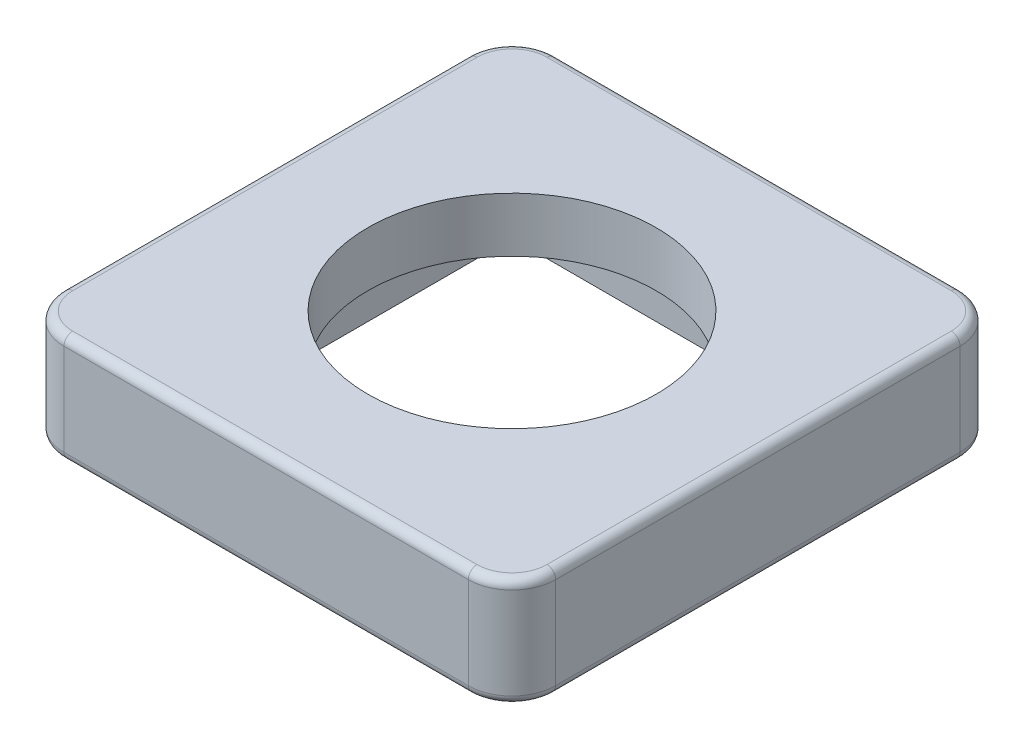
ISO-10303-21;
HEADER;
FILE_DESCRIPTION(('STEP AP214'),'2;1');
FILE_NAME('part.step','',(''),(''),'','','');
FILE_SCHEMA(('AUTOMOTIVE_DESIGN { 1 0 10303 214 1 1 1 1 }'));
ENDSEC;
DATA;
#1=APPLICATION_CONTEXT('core data for automotive mechanical design processes');
#2=APPLICATION_PROTOCOL_DEFINITION('international standard','automotive_design',2000,#1);
#3=PRODUCT_CONTEXT('',#1,'mechanical');
#4=PRODUCT('Part','Part','',(#3));
#5=PRODUCT_RELATED_PRODUCT_CATEGORY('part','',(#4));
#6=PRODUCT_DEFINITION_FORMATION('','',#4);
#7=PRODUCT_DEFINITION_CONTEXT('part definition',#1,'design');
#8=PRODUCT_DEFINITION('design','',#6,#7);
#9=PRODUCT_DEFINITION_SHAPE('','',#8);
#10=(LENGTH_UNIT() NAMED_UNIT(*) SI_UNIT(.MILLI.,.METRE.));
#11=(NAMED_UNIT(*) PLANE_ANGLE_UNIT() SI_UNIT($,.RADIAN.));
#12=(NAMED_UNIT(*) SI_UNIT($,.STERADIAN.) SOLID_ANGLE_UNIT());
#13=UNCERTAINTY_MEASURE_WITH_UNIT(LENGTH_MEASURE(1.E-05),#10,'distance_accuracy_value','');
#14=(GEOMETRIC_REPRESENTATION_CONTEXT(3) GLOBAL_UNCERTAINTY_ASSIGNED_CONTEXT((#13)) GLOBAL_UNIT_ASSIGNED_CONTEXT((#10,
#11,#12)) REPRESENTATION_CONTEXT('',''));
#15=CARTESIAN_POINT('',(0.,0.,0.));
#16=DIRECTION('',(0.,0.,1.));
#17=DIRECTION('',(1.,0.,0.));
#18=AXIS2_PLACEMENT_3D('',#15,#16,#17);
#19=CARTESIAN_POINT('',(28.575,12.7,28.575));
#20=DIRECTION('',(-1.,0.,0.));
#21=DIRECTION('',(0.,0.,1.));
#22=AXIS2_PLACEMENT_3D('',#19,#20,#21);
#23=PLANE('',#22);
#24=DIRECTION('',(0.,-1.,0.));
#25=VECTOR('',#24,1.);
#26=CARTESIAN_POINT('',(28.575,12.7,23.495));
#27=LINE('',#26,#25);
#28=CARTESIAN_POINT('',(28.575,11.684,23.495));
#29=VERTEX_POINT('',#28);
#30=CARTESIAN_POINT('',(28.575,1.016,23.495));
#31=VERTEX_POINT('',#30);
#32=EDGE_CURVE('E234',#29,#31,#27,.T.);
#33=ORIENTED_EDGE('',*,*,#32,.T.);
#34=DIRECTION('',(0.,0.,-1.));
#35=VECTOR('',#34,1.);
#36=CARTESIAN_POINT('',(28.575,1.016,-23.495));
#37=LINE('',#36,#35);
#38=CARTESIAN_POINT('',(28.575,1.016,-23.495));
#39=VERTEX_POINT('',#38);
#40=EDGE_CURVE('E276',#31,#39,#37,.T.);
#41=ORIENTED_EDGE('',*,*,#40,.T.);
#42=DIRECTION('',(0.,-1.,0.));
#43=VECTOR('',#42,1.);
#44=CARTESIAN_POINT('',(28.575,12.7,-23.495));
#45=LINE('',#44,#43);
#46=CARTESIAN_POINT('',(28.575,11.684,-23.495));
#47=VERTEX_POINT('',#46);
#48=EDGE_CURVE('E231',#39,#47,#45,.F.);
#49=ORIENTED_EDGE('',*,*,#48,.T.);
#50=DIRECTION('',(0.,0.,-1.));
#51=VECTOR('',#50,1.);
#52=CARTESIAN_POINT('',(28.575,11.684,28.575));
#53=LINE('',#52,#51);
#54=EDGE_CURVE('E274',#47,#29,#53,.F.);
#55=ORIENTED_EDGE('',*,*,#54,.T.);
#56=EDGE_LOOP('',(#33,#41,#49,#55));
#57=FACE_BOUND('',#56,.T.);
#58=ADVANCED_FACE('F33',(#57),#23,.F.);
#59=CARTESIAN_POINT('',(-28.575,12.7,-28.575));
#60=DIRECTION('',(0.,0.,1.));
#61=DIRECTION('',(1.,0.,0.));
#62=AXIS2_PLACEMENT_3D('',#59,#60,#61);
#63=PLANE('',#62);
#64=DIRECTION('',(0.,-1.,0.));
#65=VECTOR('',#64,1.);
#66=CARTESIAN_POINT('',(23.495,12.7,-28.575));
#67=LINE('',#66,#65);
#68=CARTESIAN_POINT('',(23.495,11.684,-28.575));
#69=VERTEX_POINT('',#68);
#70=CARTESIAN_POINT('',(23.495,1.016,-28.575));
#71=VERTEX_POINT('',#70);
#72=EDGE_CURVE('E240',#69,#71,#67,.T.);
#73=ORIENTED_EDGE('',*,*,#72,.T.);
#74=DIRECTION('',(-1.,0.,0.));
#75=VECTOR('',#74,1.);
#76=CARTESIAN_POINT('',(-23.495,1.016,-28.575));
#77=LINE('',#76,#75);
#78=CARTESIAN_POINT('',(-23.495,1.016,-28.575));
#79=VERTEX_POINT('',#78);
#80=EDGE_CURVE('E268',#71,#79,#77,.T.);
#81=ORIENTED_EDGE('',*,*,#80,.T.);
#82=DIRECTION('',(0.,-1.,0.));
#83=VECTOR('',#82,1.);
#84=CARTESIAN_POINT('',(-23.495,12.7,-28.575));
#85=LINE('',#84,#83);
#86=CARTESIAN_POINT('',(-23.495,11.684,-28.575));
#87=VERTEX_POINT('',#86);
#88=EDGE_CURVE('E237',#79,#87,#85,.F.);
#89=ORIENTED_EDGE('',*,*,#88,.T.);
#90=DIRECTION('',(-1.,0.,0.));
#91=VECTOR('',#90,1.);
#92=CARTESIAN_POINT('',(-28.575,11.684,-28.575));
#93=LINE('',#92,#91);
#94=EDGE_CURVE('E266',#87,#69,#93,.F.);
#95=ORIENTED_EDGE('',*,*,#94,.T.);
#96=EDGE_LOOP('',(#73,#81,#89,#95));
#97=FACE_BOUND('',#96,.T.);
#98=ADVANCED_FACE('F407',(#97),#63,.F.);
#99=CARTESIAN_POINT('',(-28.575,12.7,28.575));
#100=DIRECTION('',(1.,0.,0.));
#101=DIRECTION('',(0.,0.,-1.));
#102=AXIS2_PLACEMENT_3D('',#99,#100,#101);
#103=PLANE('',#102);
#104=DIRECTION('',(0.,-1.,0.));
#105=VECTOR('',#104,1.);
#106=CARTESIAN_POINT('',(-28.575,12.7,-23.495));
#107=LINE('',#106,#105);
#108=CARTESIAN_POINT('',(-28.575,11.684,-23.495));
#109=VERTEX_POINT('',#108);
#110=CARTESIAN_POINT('',(-28.575,1.016,-23.495));
#111=VERTEX_POINT('',#110);
#112=EDGE_CURVE('E225',#109,#111,#107,.T.);
#113=ORIENTED_EDGE('',*,*,#112,.T.);
#114=DIRECTION('',(0.,0.,1.));
#115=VECTOR('',#114,1.);
#116=CARTESIAN_POINT('',(-28.575,1.016,23.495));
#117=LINE('',#116,#115);
#118=CARTESIAN_POINT('',(-28.575,1.016,23.495));
#119=VERTEX_POINT('',#118);
#120=EDGE_CURVE('E11',#111,#119,#117,.T.);
#121=ORIENTED_EDGE('',*,*,#120,.T.);
#122=DIRECTION('',(0.,-1.,0.));
#123=VECTOR('',#122,1.);
#124=CARTESIAN_POINT('',(-28.575,12.7,23.495));
#125=LINE('',#124,#123);
#126=CARTESIAN_POINT('',(-28.575,11.684,23.495));
#127=VERTEX_POINT('',#126);
#128=EDGE_CURVE('E228',#119,#127,#125,.F.);
#129=ORIENTED_EDGE('',*,*,#128,.T.);
#130=DIRECTION('',(0.,0.,1.));
#131=VECTOR('',#130,1.);
#132=CARTESIAN_POINT('',(-28.575,11.684,28.575));
#133=LINE('',#132,#131);
#134=EDGE_CURVE('E42',#127,#109,#133,.F.);
#135=ORIENTED_EDGE('',*,*,#134,.T.);
#136=EDGE_LOOP('',(#113,#121,#129,#135));
#137=FACE_BOUND('',#136,.T.);
#138=ADVANCED_FACE('F421',(#137),#103,.F.);
#139=CARTESIAN_POINT('',(-28.575,12.7,28.575));
#140=DIRECTION('',(0.,0.,-1.));
#141=DIRECTION('',(-1.,0.,0.));
#142=AXIS2_PLACEMENT_3D('',#139,#140,#141);
#143=PLANE('',#142);
#144=DIRECTION('',(0.,-1.,0.));
#145=VECTOR('',#144,1.);
#146=CARTESIAN_POINT('',(-23.495,12.7,28.575));
#147=LINE('',#146,#145);
#148=CARTESIAN_POINT('',(-23.495,11.684,28.575));
#149=VERTEX_POINT('',#148);
#150=CARTESIAN_POINT('',(-23.495,1.016,28.575));
#151=VERTEX_POINT('',#150);
#152=EDGE_CURVE('E221',#149,#151,#147,.T.);
#153=ORIENTED_EDGE('',*,*,#152,.T.);
#154=DIRECTION('',(1.,0.,0.));
#155=VECTOR('',#154,1.);
#156=CARTESIAN_POINT('',(23.495,1.016,28.575));
#157=LINE('',#156,#155);
#158=CARTESIAN_POINT('',(23.495,1.016,28.575));
#159=VERTEX_POINT('',#158);
#160=EDGE_CURVE('E284',#151,#159,#157,.T.);
#161=ORIENTED_EDGE('',*,*,#160,.T.);
#162=DIRECTION('',(0.,-1.,0.));
#163=VECTOR('',#162,1.);
#164=CARTESIAN_POINT('',(23.495,12.7,28.575));
#165=LINE('',#164,#163);
#166=CARTESIAN_POINT('',(23.495,11.684,28.575));
#167=VERTEX_POINT('',#166);
#168=EDGE_CURVE('E218',#159,#167,#165,.F.);
#169=ORIENTED_EDGE('',*,*,#168,.T.);
#170=DIRECTION('',(1.,0.,0.));
#171=VECTOR('',#170,1.);
#172=CARTESIAN_POINT('',(-28.575,11.684,28.575));
#173=LINE('',#172,#171);
#174=EDGE_CURVE('E282',#167,#149,#173,.F.);
#175=ORIENTED_EDGE('',*,*,#174,.T.);
#176=EDGE_LOOP('',(#153,#161,#169,#175));
#177=FACE_BOUND('',#176,.T.);
#178=ADVANCED_FACE('F363',(#177),#143,.F.);
#179=CARTESIAN_POINT('',(0.,12.7,0.));
#180=DIRECTION('',(0.,-1.,0.));
#181=DIRECTION('',(0.,0.,-1.));
#182=AXIS2_PLACEMENT_3D('',#179,#180,#181);
#183=PLANE('',#182);
#184=CARTESIAN_POINT('',(0.,12.7,0.));
#185=DIRECTION('',(0.,1.,0.));
#186=DIRECTION('',(0.,0.,1.));
#187=AXIS2_PLACEMENT_3D('',#184,#185,#186);
#188=CIRCLE('',#187,16.764);
#189=CARTESIAN_POINT('',(0.,12.7,16.764));
#190=VERTEX_POINT('',#189);
#191=EDGE_CURVE('E214',#190,#190,#188,.T.);
#192=ORIENTED_EDGE('',*,*,#191,.F.);
#193=EDGE_LOOP('',(#192));
#194=FACE_BOUND('',#193,.T.);
#195=DIRECTION('',(-1.,0.,0.));
#196=VECTOR('',#195,1.);
#197=CARTESIAN_POINT('',(0.,12.7,-27.559));
#198=LINE('',#197,#196);
#199=CARTESIAN_POINT('',(23.495,12.7,-27.559));
#200=VERTEX_POINT('',#199);
#201=CARTESIAN_POINT('',(-23.495,12.7,-27.559));
#202=VERTEX_POINT('',#201);
#203=EDGE_CURVE('E58',#200,#202,#198,.T.);
#204=ORIENTED_EDGE('',*,*,#203,.T.);
#205=CARTESIAN_POINT('',(-23.495,12.7,-23.495));
#206=DIRECTION('',(0.,-1.,0.));
#207=DIRECTION('',(0.,0.,-1.));
#208=AXIS2_PLACEMENT_3D('',#205,#206,#207);
#209=CIRCLE('',#208,4.064);
#210=CARTESIAN_POINT('',(-27.559,12.7,-23.495));
#211=VERTEX_POINT('',#210);
#212=EDGE_CURVE('E303',#202,#211,#209,.F.);
#213=ORIENTED_EDGE('',*,*,#212,.T.);
#214=DIRECTION('',(0.,0.,1.));
#215=VECTOR('',#214,1.);
#216=CARTESIAN_POINT('',(-27.559,12.7,0.));
#217=LINE('',#216,#215);
#218=CARTESIAN_POINT('',(-27.559,12.7,23.495));
#219=VERTEX_POINT('',#218);
#220=EDGE_CURVE('E290',#211,#219,#217,.T.);
#221=ORIENTED_EDGE('',*,*,#220,.T.);
#222=CARTESIAN_POINT('',(-23.495,12.7,23.495));
#223=DIRECTION('',(0.,-1.,0.));
#224=DIRECTION('',(0.,0.,-1.));
#225=AXIS2_PLACEMENT_3D('',#222,#223,#224);
#226=CIRCLE('',#225,4.064);
#227=CARTESIAN_POINT('',(-23.495,12.7,27.559));
#228=VERTEX_POINT('',#227);
#229=EDGE_CURVE('E292',#219,#228,#226,.F.);
#230=ORIENTED_EDGE('',*,*,#229,.T.);
#231=DIRECTION('',(1.,0.,0.));
#232=VECTOR('',#231,1.);
#233=CARTESIAN_POINT('',(0.,12.7,27.559));
#234=LINE('',#233,#232);
#235=CARTESIAN_POINT('',(23.495,12.7,27.559));
#236=VERTEX_POINT('',#235);
#237=EDGE_CURVE('E294',#228,#236,#234,.T.);
#238=ORIENTED_EDGE('',*,*,#237,.T.);
#239=CARTESIAN_POINT('',(23.495,12.7,23.495));
#240=DIRECTION('',(0.,-1.,0.));
#241=DIRECTION('',(0.,0.,-1.));
#242=AXIS2_PLACEMENT_3D('',#239,#240,#241);
#243=CIRCLE('',#242,4.064);
#244=CARTESIAN_POINT('',(27.559,12.7,23.495));
#245=VERTEX_POINT('',#244);
#246=EDGE_CURVE('E296',#236,#245,#243,.F.);
#247=ORIENTED_EDGE('',*,*,#246,.T.);
#248=DIRECTION('',(0.,0.,-1.));
#249=VECTOR('',#248,1.);
#250=CARTESIAN_POINT('',(27.559,12.7,0.));
#251=LINE('',#250,#249);
#252=CARTESIAN_POINT('',(27.559,12.7,-23.495));
#253=VERTEX_POINT('',#252);
#254=EDGE_CURVE('E298',#245,#253,#251,.T.);
#255=ORIENTED_EDGE('',*,*,#254,.T.);
#256=CARTESIAN_POINT('',(23.495,12.7,-23.495));
#257=DIRECTION('',(0.,-1.,0.));
#258=DIRECTION('',(0.,0.,-1.));
#259=AXIS2_PLACEMENT_3D('',#256,#257,#258);
#260=CIRCLE('',#259,4.064);
#261=EDGE_CURVE('E300',#253,#200,#260,.F.);
#262=ORIENTED_EDGE('',*,*,#261,.T.);
#263=EDGE_LOOP('',(#204,#213,#221,#230,#238,#247,#255,#262));
#264=FACE_BOUND('',#263,.T.);
#265=ADVANCED_FACE('F445',(#194,#264),#183,.F.);
#266=CARTESIAN_POINT('',(0.,0.,0.));
#267=DIRECTION('',(0.,-1.,0.));
#268=DIRECTION('',(0.,0.,-1.));
#269=AXIS2_PLACEMENT_3D('',#266,#267,#268);
#270=PLANE('',#269);
#271=DIRECTION('',(0.,0.,1.));
#272=VECTOR('',#271,1.);
#273=CARTESIAN_POINT('',(20.,0.,-20.));
#274=LINE('',#273,#272);
#275=CARTESIAN_POINT('',(20.,0.,-20.));
#276=VERTEX_POINT('',#275);
#277=CARTESIAN_POINT('',(20.,0.,20.));
#278=VERTEX_POINT('',#277);
#279=EDGE_CURVE('E50',#276,#278,#274,.T.);
#280=ORIENTED_EDGE('',*,*,#279,.F.);
#281=DIRECTION('',(1.,0.,0.));
#282=VECTOR('',#281,1.);
#283=CARTESIAN_POINT('',(-20.,0.,-20.));
#284=LINE('',#283,#282);
#285=CARTESIAN_POINT('',(-20.,0.,-20.));
#286=VERTEX_POINT('',#285);
#287=EDGE_CURVE('E193',#286,#276,#284,.T.);
#288=ORIENTED_EDGE('',*,*,#287,.F.);
#289=DIRECTION('',(0.,0.,-1.));
#290=VECTOR('',#289,1.);
#291=CARTESIAN_POINT('',(-20.,0.,-20.));
#292=LINE('',#291,#290);
#293=CARTESIAN_POINT('',(-20.,0.,20.));
#294=VERTEX_POINT('',#293);
#295=EDGE_CURVE('E196',#294,#286,#292,.T.);
#296=ORIENTED_EDGE('',*,*,#295,.F.);
#297=DIRECTION('',(-1.,0.,0.));
#298=VECTOR('',#297,1.);
#299=CARTESIAN_POINT('',(-20.,0.,20.));
#300=LINE('',#299,#298);
#301=EDGE_CURVE('E202',#278,#294,#300,.T.);
#302=ORIENTED_EDGE('',*,*,#301,.F.);
#303=EDGE_LOOP('',(#280,#288,#296,#302));
#304=FACE_BOUND('',#303,.T.);
#305=DIRECTION('',(0.,0.,1.));
#306=VECTOR('',#305,1.);
#307=CARTESIAN_POINT('',(-27.559,0.,-23.495));
#308=LINE('',#307,#306);
#309=CARTESIAN_POINT('',(-27.559,0.,23.495));
#310=VERTEX_POINT('',#309);
#311=CARTESIAN_POINT('',(-27.559,0.,-23.495));
#312=VERTEX_POINT('',#311);
#313=EDGE_CURVE('E243',#310,#312,#308,.F.);
#314=ORIENTED_EDGE('',*,*,#313,.T.);
#315=CARTESIAN_POINT('',(-23.495,0.,-23.495));
#316=DIRECTION('',(0.,-1.,0.));
#317=DIRECTION('',(0.,0.,-1.));
#318=AXIS2_PLACEMENT_3D('',#315,#316,#317);
#319=CIRCLE('',#318,4.064);
#320=CARTESIAN_POINT('',(-23.495,0.,-27.559));
#321=VERTEX_POINT('',#320);
#322=EDGE_CURVE('E257',#312,#321,#319,.T.);
#323=ORIENTED_EDGE('',*,*,#322,.T.);
#324=DIRECTION('',(-1.,0.,0.));
#325=VECTOR('',#324,1.);
#326=CARTESIAN_POINT('',(23.495,0.,-27.559));
#327=LINE('',#326,#325);
#328=CARTESIAN_POINT('',(23.495,0.,-27.559));
#329=VERTEX_POINT('',#328);
#330=EDGE_CURVE('E255',#321,#329,#327,.F.);
#331=ORIENTED_EDGE('',*,*,#330,.T.);
#332=CARTESIAN_POINT('',(23.495,0.,-23.495));
#333=DIRECTION('',(0.,-1.,0.));
#334=DIRECTION('',(0.,0.,-1.));
#335=AXIS2_PLACEMENT_3D('',#332,#333,#334);
#336=CIRCLE('',#335,4.064);
#337=CARTESIAN_POINT('',(27.559,0.,-23.495));
#338=VERTEX_POINT('',#337);
#339=EDGE_CURVE('E253',#329,#338,#336,.T.);
#340=ORIENTED_EDGE('',*,*,#339,.T.);
#341=DIRECTION('',(0.,0.,-1.));
#342=VECTOR('',#341,1.);
#343=CARTESIAN_POINT('',(27.559,0.,23.495));
#344=LINE('',#343,#342);
#345=CARTESIAN_POINT('',(27.559,0.,23.495));
#346=VERTEX_POINT('',#345);
#347=EDGE_CURVE('E251',#338,#346,#344,.F.);
#348=ORIENTED_EDGE('',*,*,#347,.T.);
#349=CARTESIAN_POINT('',(23.495,0.,23.495));
#350=DIRECTION('',(0.,-1.,0.));
#351=DIRECTION('',(0.,0.,-1.));
#352=AXIS2_PLACEMENT_3D('',#349,#350,#351);
#353=CIRCLE('',#352,4.064);
#354=CARTESIAN_POINT('',(23.495,0.,27.559));
#355=VERTEX_POINT('',#354);
#356=EDGE_CURVE('E249',#346,#355,#353,.T.);
#357=ORIENTED_EDGE('',*,*,#356,.T.);
#358=DIRECTION('',(1.,0.,0.));
#359=VECTOR('',#358,1.);
#360=CARTESIAN_POINT('',(-23.495,0.,27.559));
#361=LINE('',#360,#359);
#362=CARTESIAN_POINT('',(-23.495,0.,27.559));
#363=VERTEX_POINT('',#362);
#364=EDGE_CURVE('E247',#355,#363,#361,.F.);
#365=ORIENTED_EDGE('',*,*,#364,.T.);
#366=CARTESIAN_POINT('',(-23.495,0.,23.495));
#367=DIRECTION('',(0.,-1.,0.));
#368=DIRECTION('',(0.,0.,-1.));
#369=AXIS2_PLACEMENT_3D('',#366,#367,#368);
#370=CIRCLE('',#369,4.064);
#371=EDGE_CURVE('E245',#363,#310,#370,.T.);
#372=ORIENTED_EDGE('',*,*,#371,.T.);
#373=EDGE_LOOP('',(#314,#323,#331,#340,#348,#357,#365,#372));
#374=FACE_BOUND('',#373,.T.);
#375=ADVANCED_FACE('F378',(#304,#374),#270,.T.);
#376=CARTESIAN_POINT('',(-23.495,12.7,23.495));
#377=DIRECTION('',(0.,-1.,0.));
#378=DIRECTION('',(0.,0.,-1.));
#379=AXIS2_PLACEMENT_3D('',#376,#377,#378);
#380=CYLINDRICAL_SURFACE('',#379,5.08);
#381=ORIENTED_EDGE('',*,*,#128,.F.);
#382=CARTESIAN_POINT('',(-23.495,1.016,23.495));
#383=DIRECTION('',(0.,-1.,0.));
#384=DIRECTION('',(0.,0.,-1.));
#385=AXIS2_PLACEMENT_3D('',#382,#383,#384);
#386=CIRCLE('',#385,5.08);
#387=EDGE_CURVE('E288',#119,#151,#386,.F.);
#388=ORIENTED_EDGE('',*,*,#387,.T.);
#389=ORIENTED_EDGE('',*,*,#152,.F.);
#390=CARTESIAN_POINT('',(-23.495,11.684,23.495));
#391=DIRECTION('',(0.,-1.,0.));
#392=DIRECTION('',(0.,0.,-1.));
#393=AXIS2_PLACEMENT_3D('',#390,#391,#392);
#394=CIRCLE('',#393,5.08);
#395=EDGE_CURVE('E286',#149,#127,#394,.T.);
#396=ORIENTED_EDGE('',*,*,#395,.T.);
#397=EDGE_LOOP('',(#381,#388,#389,#396));
#398=FACE_BOUND('',#397,.T.);
#399=ADVANCED_FACE('F424',(#398),#380,.T.);
#400=CARTESIAN_POINT('',(23.495,12.7,23.495));
#401=DIRECTION('',(0.,-1.,0.));
#402=DIRECTION('',(0.,0.,-1.));
#403=AXIS2_PLACEMENT_3D('',#400,#401,#402);
#404=CYLINDRICAL_SURFACE('',#403,5.08);
#405=ORIENTED_EDGE('',*,*,#168,.F.);
#406=CARTESIAN_POINT('',(23.495,1.016,23.495));
#407=DIRECTION('',(0.,-1.,0.));
#408=DIRECTION('',(0.,0.,-1.));
#409=AXIS2_PLACEMENT_3D('',#406,#407,#408);
#410=CIRCLE('',#409,5.08);
#411=EDGE_CURVE('E280',#159,#31,#410,.F.);
#412=ORIENTED_EDGE('',*,*,#411,.T.);
#413=ORIENTED_EDGE('',*,*,#32,.F.);
#414=CARTESIAN_POINT('',(23.495,11.684,23.495));
#415=DIRECTION('',(0.,-1.,0.));
#416=DIRECTION('',(0.,0.,-1.));
#417=AXIS2_PLACEMENT_3D('',#414,#415,#416);
#418=CIRCLE('',#417,5.08);
#419=EDGE_CURVE('E278',#29,#167,#418,.T.);
#420=ORIENTED_EDGE('',*,*,#419,.T.);
#421=EDGE_LOOP('',(#405,#412,#413,#420));
#422=FACE_BOUND('',#421,.T.);
#423=ADVANCED_FACE('F360',(#422),#404,.T.);
#424=CARTESIAN_POINT('',(23.495,12.7,-23.495));
#425=DIRECTION('',(0.,-1.,0.));
#426=DIRECTION('',(0.,0.,-1.));
#427=AXIS2_PLACEMENT_3D('',#424,#425,#426);
#428=CYLINDRICAL_SURFACE('',#427,5.08);
#429=ORIENTED_EDGE('',*,*,#48,.F.);
#430=CARTESIAN_POINT('',(23.495,1.016,-23.495));
#431=DIRECTION('',(0.,-1.,0.));
#432=DIRECTION('',(0.,0.,-1.));
#433=AXIS2_PLACEMENT_3D('',#430,#431,#432);
#434=CIRCLE('',#433,5.08);
#435=EDGE_CURVE('E272',#39,#71,#434,.F.);
#436=ORIENTED_EDGE('',*,*,#435,.T.);
#437=ORIENTED_EDGE('',*,*,#72,.F.);
#438=CARTESIAN_POINT('',(23.495,11.684,-23.495));
#439=DIRECTION('',(0.,-1.,0.));
#440=DIRECTION('',(0.,0.,-1.));
#441=AXIS2_PLACEMENT_3D('',#438,#439,#440);
#442=CIRCLE('',#441,5.08);
#443=EDGE_CURVE('E270',#69,#47,#442,.T.);
#444=ORIENTED_EDGE('',*,*,#443,.T.);
#445=EDGE_LOOP('',(#429,#436,#437,#444));
#446=FACE_BOUND('',#445,.T.);
#447=ADVANCED_FACE('F390',(#446),#428,.T.);
#448=CARTESIAN_POINT('',(-23.495,12.7,-23.495));
#449=DIRECTION('',(0.,-1.,0.));
#450=DIRECTION('',(0.,0.,-1.));
#451=AXIS2_PLACEMENT_3D('',#448,#449,#450);
#452=CYLINDRICAL_SURFACE('',#451,5.08);
#453=ORIENTED_EDGE('',*,*,#88,.F.);
#454=CARTESIAN_POINT('',(-23.495,1.016,-23.495));
#455=DIRECTION('',(0.,-1.,0.));
#456=DIRECTION('',(0.,0.,-1.));
#457=AXIS2_PLACEMENT_3D('',#454,#455,#456);
#458=CIRCLE('',#457,5.08);
#459=EDGE_CURVE('E263',#79,#111,#458,.F.);
#460=ORIENTED_EDGE('',*,*,#459,.T.);
#461=ORIENTED_EDGE('',*,*,#112,.F.);
#462=CARTESIAN_POINT('',(-23.495,11.684,-23.495));
#463=DIRECTION('',(0.,-1.,0.));
#464=DIRECTION('',(0.,0.,-1.));
#465=AXIS2_PLACEMENT_3D('',#462,#463,#464);
#466=CIRCLE('',#465,5.08);
#467=EDGE_CURVE('E260',#109,#87,#466,.T.);
#468=ORIENTED_EDGE('',*,*,#467,.T.);
#469=EDGE_LOOP('',(#453,#460,#461,#468));
#470=FACE_BOUND('',#469,.T.);
#471=ADVANCED_FACE('F410',(#470),#452,.T.);
#472=CARTESIAN_POINT('',(23.495,1.016,23.495));
#473=DIRECTION('',(0.,-1.,0.));
#474=DIRECTION('',(0.,0.,-1.));
#475=AXIS2_PLACEMENT_3D('',#472,#473,#474);
#476=TOROIDAL_SURFACE('',#475,4.064,1.016);
#477=CARTESIAN_POINT('',(27.559,1.016,23.495));
#478=DIRECTION('',(0.,0.,-1.));
#479=DIRECTION('',(-1.,0.,0.));
#480=AXIS2_PLACEMENT_3D('',#477,#478,#479);
#481=CIRCLE('',#480,1.016);
#482=EDGE_CURVE('E322',#31,#346,#481,.T.);
#483=ORIENTED_EDGE('',*,*,#482,.F.);
#484=ORIENTED_EDGE('',*,*,#411,.F.);
#485=CARTESIAN_POINT('',(23.495,1.016,27.559));
#486=DIRECTION('',(-1.,0.,0.));
#487=DIRECTION('',(0.,0.,1.));
#488=AXIS2_PLACEMENT_3D('',#485,#486,#487);
#489=CIRCLE('',#488,1.016);
#490=EDGE_CURVE('E222',#355,#159,#489,.T.);
#491=ORIENTED_EDGE('',*,*,#490,.F.);
#492=ORIENTED_EDGE('',*,*,#356,.F.);
#493=EDGE_LOOP('',(#483,#484,#491,#492));
#494=FACE_BOUND('',#493,.T.);
#495=ADVANCED_FACE('F384',(#494),#476,.T.);
#496=CARTESIAN_POINT('',(-28.575,1.016,27.559));
#497=DIRECTION('',(-1.,0.,0.));
#498=DIRECTION('',(0.,0.,1.));
#499=AXIS2_PLACEMENT_3D('',#496,#497,#498);
#500=CYLINDRICAL_SURFACE('',#499,1.016);
#501=ORIENTED_EDGE('',*,*,#490,.T.);
#502=ORIENTED_EDGE('',*,*,#160,.F.);
#503=CARTESIAN_POINT('',(-23.495,1.016,27.559));
#504=DIRECTION('',(-1.,0.,0.));
#505=DIRECTION('',(0.,0.,1.));
#506=AXIS2_PLACEMENT_3D('',#503,#504,#505);
#507=CIRCLE('',#506,1.016);
#508=EDGE_CURVE('E319',#363,#151,#507,.T.);
#509=ORIENTED_EDGE('',*,*,#508,.F.);
#510=ORIENTED_EDGE('',*,*,#364,.F.);
#511=EDGE_LOOP('',(#501,#502,#509,#510));
#512=FACE_BOUND('',#511,.T.);
#513=ADVANCED_FACE('F368',(#512),#500,.T.);
#514=CARTESIAN_POINT('',(27.559,1.016,28.575));
#515=DIRECTION('',(0.,0.,1.));
#516=DIRECTION('',(1.,0.,0.));
#517=AXIS2_PLACEMENT_3D('',#514,#515,#516);
#518=CYLINDRICAL_SURFACE('',#517,1.016);
#519=ORIENTED_EDGE('',*,*,#482,.T.);
#520=ORIENTED_EDGE('',*,*,#347,.F.);
#521=CARTESIAN_POINT('',(27.559,1.016,-23.495));
#522=DIRECTION('',(0.,0.,-1.));
#523=DIRECTION('',(-1.,0.,0.));
#524=AXIS2_PLACEMENT_3D('',#521,#522,#523);
#525=CIRCLE('',#524,1.016);
#526=EDGE_CURVE('E316',#39,#338,#525,.T.);
#527=ORIENTED_EDGE('',*,*,#526,.F.);
#528=ORIENTED_EDGE('',*,*,#40,.F.);
#529=EDGE_LOOP('',(#519,#520,#527,#528));
#530=FACE_BOUND('',#529,.T.);
#531=ADVANCED_FACE('F395',(#530),#518,.T.);
#532=CARTESIAN_POINT('',(-23.495,1.016,23.495));
#533=DIRECTION('',(0.,-1.,0.));
#534=DIRECTION('',(0.,0.,-1.));
#535=AXIS2_PLACEMENT_3D('',#532,#533,#534);
#536=TOROIDAL_SURFACE('',#535,4.064,1.016);
#537=ORIENTED_EDGE('',*,*,#508,.T.);
#538=ORIENTED_EDGE('',*,*,#387,.F.);
#539=CARTESIAN_POINT('',(-27.559,1.016,23.495));
#540=DIRECTION('',(0.,0.,-1.));
#541=DIRECTION('',(-1.,0.,0.));
#542=AXIS2_PLACEMENT_3D('',#539,#540,#541);
#543=CIRCLE('',#542,1.016);
#544=EDGE_CURVE('E313',#310,#119,#543,.T.);
#545=ORIENTED_EDGE('',*,*,#544,.F.);
#546=ORIENTED_EDGE('',*,*,#371,.F.);
#547=EDGE_LOOP('',(#537,#538,#545,#546));
#548=FACE_BOUND('',#547,.T.);
#549=ADVANCED_FACE('F374',(#548),#536,.T.);
#550=CARTESIAN_POINT('',(23.495,1.016,-23.495));
#551=DIRECTION('',(0.,-1.,0.));
#552=DIRECTION('',(0.,0.,-1.));
#553=AXIS2_PLACEMENT_3D('',#550,#551,#552);
#554=TOROIDAL_SURFACE('',#553,4.064,1.016);
#555=ORIENTED_EDGE('',*,*,#526,.T.);
#556=ORIENTED_EDGE('',*,*,#339,.F.);
#557=CARTESIAN_POINT('',(23.495,1.016,-27.559));
#558=DIRECTION('',(-1.,0.,0.));
#559=DIRECTION('',(0.,0.,1.));
#560=AXIS2_PLACEMENT_3D('',#557,#558,#559);
#561=CIRCLE('',#560,1.016);
#562=EDGE_CURVE('E310',#71,#329,#561,.T.);
#563=ORIENTED_EDGE('',*,*,#562,.F.);
#564=ORIENTED_EDGE('',*,*,#435,.F.);
#565=EDGE_LOOP('',(#555,#556,#563,#564));
#566=FACE_BOUND('',#565,.T.);
#567=ADVANCED_FACE('F399',(#566),#554,.T.);
#568=CARTESIAN_POINT('',(-27.559,1.016,28.575));
#569=DIRECTION('',(0.,0.,-1.));
#570=DIRECTION('',(-1.,0.,0.));
#571=AXIS2_PLACEMENT_3D('',#568,#569,#570);
#572=CYLINDRICAL_SURFACE('',#571,1.016);
#573=ORIENTED_EDGE('',*,*,#544,.T.);
#574=ORIENTED_EDGE('',*,*,#120,.F.);
#575=CARTESIAN_POINT('',(-27.559,1.016,-23.495));
#576=DIRECTION('',(0.,0.,-1.));
#577=DIRECTION('',(-1.,0.,0.));
#578=AXIS2_PLACEMENT_3D('',#575,#576,#577);
#579=CIRCLE('',#578,1.016);
#580=EDGE_CURVE('E308',#312,#111,#579,.T.);
#581=ORIENTED_EDGE('',*,*,#580,.F.);
#582=ORIENTED_EDGE('',*,*,#313,.F.);
#583=EDGE_LOOP('',(#573,#574,#581,#582));
#584=FACE_BOUND('',#583,.T.);
#585=ADVANCED_FACE('F418',(#584),#572,.T.);
#586=CARTESIAN_POINT('',(-28.575,1.016,-27.559));
#587=DIRECTION('',(1.,0.,0.));
#588=DIRECTION('',(0.,0.,-1.));
#589=AXIS2_PLACEMENT_3D('',#586,#587,#588);
#590=CYLINDRICAL_SURFACE('',#589,1.016);
#591=ORIENTED_EDGE('',*,*,#562,.T.);
#592=ORIENTED_EDGE('',*,*,#330,.F.);
#593=CARTESIAN_POINT('',(-23.495,1.016,-27.559));
#594=DIRECTION('',(-1.,0.,0.));
#595=DIRECTION('',(0.,0.,1.));
#596=AXIS2_PLACEMENT_3D('',#593,#594,#595);
#597=CIRCLE('',#596,1.016);
#598=EDGE_CURVE('E306',#79,#321,#597,.T.);
#599=ORIENTED_EDGE('',*,*,#598,.F.);
#600=ORIENTED_EDGE('',*,*,#80,.F.);
#601=EDGE_LOOP('',(#591,#592,#599,#600));
#602=FACE_BOUND('',#601,.T.);
#603=ADVANCED_FACE('F404',(#602),#590,.T.);
#604=CARTESIAN_POINT('',(-23.495,1.016,-23.495));
#605=DIRECTION('',(0.,-1.,0.));
#606=DIRECTION('',(0.,0.,-1.));
#607=AXIS2_PLACEMENT_3D('',#604,#605,#606);
#608=TOROIDAL_SURFACE('',#607,4.064,1.016);
#609=ORIENTED_EDGE('',*,*,#580,.T.);
#610=ORIENTED_EDGE('',*,*,#459,.F.);
#611=ORIENTED_EDGE('',*,*,#598,.T.);
#612=ORIENTED_EDGE('',*,*,#322,.F.);
#613=EDGE_LOOP('',(#609,#610,#611,#612));
#614=FACE_BOUND('',#613,.T.);
#615=ADVANCED_FACE('F414',(#614),#608,.T.);
#616=CARTESIAN_POINT('',(23.495,11.684,23.495));
#617=DIRECTION('',(0.,-1.,0.));
#618=DIRECTION('',(0.,0.,-1.));
#619=AXIS2_PLACEMENT_3D('',#616,#617,#618);
#620=TOROIDAL_SURFACE('',#619,4.064,1.016);
#621=CARTESIAN_POINT('',(23.495,11.684,27.559));
#622=DIRECTION('',(-1.,0.,0.));
#623=DIRECTION('',(0.,0.,1.));
#624=AXIS2_PLACEMENT_3D('',#621,#622,#623);
#625=CIRCLE('',#624,1.016);
#626=EDGE_CURVE('E341',#167,#236,#625,.T.);
#627=ORIENTED_EDGE('',*,*,#626,.F.);
#628=ORIENTED_EDGE('',*,*,#419,.F.);
#629=CARTESIAN_POINT('',(27.559,11.684,23.495));
#630=DIRECTION('',(0.,0.,-1.));
#631=DIRECTION('',(-1.,0.,0.));
#632=AXIS2_PLACEMENT_3D('',#629,#630,#631);
#633=CIRCLE('',#632,1.016);
#634=EDGE_CURVE('E37',#245,#29,#633,.T.);
#635=ORIENTED_EDGE('',*,*,#634,.F.);
#636=ORIENTED_EDGE('',*,*,#246,.F.);
#637=EDGE_LOOP('',(#627,#628,#635,#636));
#638=FACE_BOUND('',#637,.T.);
#639=ADVANCED_FACE('F35',(#638),#620,.T.);
#640=CARTESIAN_POINT('',(27.559,11.684,0.));
#641=DIRECTION('',(0.,0.,-1.));
#642=DIRECTION('',(-1.,0.,0.));
#643=AXIS2_PLACEMENT_3D('',#640,#641,#642);
#644=CYLINDRICAL_SURFACE('',#643,1.016);
#645=ORIENTED_EDGE('',*,*,#634,.T.);
#646=ORIENTED_EDGE('',*,*,#54,.F.);
#647=CARTESIAN_POINT('',(27.559,11.684,-23.495));
#648=DIRECTION('',(0.,0.,-1.));
#649=DIRECTION('',(-1.,0.,0.));
#650=AXIS2_PLACEMENT_3D('',#647,#648,#649);
#651=CIRCLE('',#650,1.016);
#652=EDGE_CURVE('E339',#253,#47,#651,.T.);
#653=ORIENTED_EDGE('',*,*,#652,.F.);
#654=ORIENTED_EDGE('',*,*,#254,.F.);
#655=EDGE_LOOP('',(#645,#646,#653,#654));
#656=FACE_BOUND('',#655,.T.);
#657=ADVANCED_FACE('F352',(#656),#644,.T.);
#658=CARTESIAN_POINT('',(0.,11.684,27.559));
#659=DIRECTION('',(1.,0.,0.));
#660=DIRECTION('',(0.,0.,-1.));
#661=AXIS2_PLACEMENT_3D('',#658,#659,#660);
#662=CYLINDRICAL_SURFACE('',#661,1.016);
#663=ORIENTED_EDGE('',*,*,#626,.T.);
#664=ORIENTED_EDGE('',*,*,#237,.F.);
#665=CARTESIAN_POINT('',(-23.495,11.684,27.559));
#666=DIRECTION('',(-1.,0.,0.));
#667=DIRECTION('',(0.,0.,1.));
#668=AXIS2_PLACEMENT_3D('',#665,#666,#667);
#669=CIRCLE('',#668,1.016);
#670=EDGE_CURVE('E336',#149,#228,#669,.T.);
#671=ORIENTED_EDGE('',*,*,#670,.F.);
#672=ORIENTED_EDGE('',*,*,#174,.F.);
#673=EDGE_LOOP('',(#663,#664,#671,#672));
#674=FACE_BOUND('',#673,.T.);
#675=ADVANCED_FACE('F446',(#674),#662,.T.);
#676=CARTESIAN_POINT('',(23.495,11.684,-23.495));
#677=DIRECTION('',(0.,-1.,0.));
#678=DIRECTION('',(0.,0.,-1.));
#679=AXIS2_PLACEMENT_3D('',#676,#677,#678);
#680=TOROIDAL_SURFACE('',#679,4.064,1.016);
#681=ORIENTED_EDGE('',*,*,#652,.T.);
#682=ORIENTED_EDGE('',*,*,#443,.F.);
#683=CARTESIAN_POINT('',(23.495,11.684,-27.559));
#684=DIRECTION('',(-1.,0.,0.));
#685=DIRECTION('',(0.,0.,1.));
#686=AXIS2_PLACEMENT_3D('',#683,#684,#685);
#687=CIRCLE('',#686,1.016);
#688=EDGE_CURVE('E333',#200,#69,#687,.T.);
#689=ORIENTED_EDGE('',*,*,#688,.F.);
#690=ORIENTED_EDGE('',*,*,#261,.F.);
#691=EDGE_LOOP('',(#681,#682,#689,#690));
#692=FACE_BOUND('',#691,.T.);
#693=ADVANCED_FACE('F443',(#692),#680,.T.);
#694=CARTESIAN_POINT('',(-23.495,11.684,23.495));
#695=DIRECTION('',(0.,-1.,0.));
#696=DIRECTION('',(0.,0.,-1.));
#697=AXIS2_PLACEMENT_3D('',#694,#695,#696);
#698=TOROIDAL_SURFACE('',#697,4.064,1.016);
#699=ORIENTED_EDGE('',*,*,#670,.T.);
#700=ORIENTED_EDGE('',*,*,#229,.F.);
#701=CARTESIAN_POINT('',(-27.559,11.684,23.495));
#702=DIRECTION('',(0.,0.,-1.));
#703=DIRECTION('',(-1.,0.,0.));
#704=AXIS2_PLACEMENT_3D('',#701,#702,#703);
#705=CIRCLE('',#704,1.016);
#706=EDGE_CURVE('E330',#127,#219,#705,.T.);
#707=ORIENTED_EDGE('',*,*,#706,.F.);
#708=ORIENTED_EDGE('',*,*,#395,.F.);
#709=EDGE_LOOP('',(#699,#700,#707,#708));
#710=FACE_BOUND('',#709,.T.);
#711=ADVANCED_FACE('F428',(#710),#698,.T.);
#712=CARTESIAN_POINT('',(0.,11.684,-27.559));
#713=DIRECTION('',(-1.,0.,0.));
#714=DIRECTION('',(0.,0.,1.));
#715=AXIS2_PLACEMENT_3D('',#712,#713,#714);
#716=CYLINDRICAL_SURFACE('',#715,1.016);
#717=ORIENTED_EDGE('',*,*,#688,.T.);
#718=ORIENTED_EDGE('',*,*,#94,.F.);
#719=CARTESIAN_POINT('',(-23.495,11.684,-27.559));
#720=DIRECTION('',(-1.,0.,0.));
#721=DIRECTION('',(0.,0.,1.));
#722=AXIS2_PLACEMENT_3D('',#719,#720,#721);
#723=CIRCLE('',#722,1.016);
#724=EDGE_CURVE('E328',#202,#87,#723,.T.);
#725=ORIENTED_EDGE('',*,*,#724,.F.);
#726=ORIENTED_EDGE('',*,*,#203,.F.);
#727=EDGE_LOOP('',(#717,#718,#725,#726));
#728=FACE_BOUND('',#727,.T.);
#729=ADVANCED_FACE('F440',(#728),#716,.T.);
#730=CARTESIAN_POINT('',(-27.559,11.684,0.));
#731=DIRECTION('',(0.,0.,1.));
#732=DIRECTION('',(1.,0.,0.));
#733=AXIS2_PLACEMENT_3D('',#730,#731,#732);
#734=CYLINDRICAL_SURFACE('',#733,1.016);
#735=ORIENTED_EDGE('',*,*,#706,.T.);
#736=ORIENTED_EDGE('',*,*,#220,.F.);
#737=CARTESIAN_POINT('',(-27.559,11.684,-23.495));
#738=DIRECTION('',(0.,0.,-1.));
#739=DIRECTION('',(-1.,0.,0.));
#740=AXIS2_PLACEMENT_3D('',#737,#738,#739);
#741=CIRCLE('',#740,1.016);
#742=EDGE_CURVE('E217',#109,#211,#741,.T.);
#743=ORIENTED_EDGE('',*,*,#742,.F.);
#744=ORIENTED_EDGE('',*,*,#134,.F.);
#745=EDGE_LOOP('',(#735,#736,#743,#744));
#746=FACE_BOUND('',#745,.T.);
#747=ADVANCED_FACE('F434',(#746),#734,.T.);
#748=CARTESIAN_POINT('',(-23.495,11.684,-23.495));
#749=DIRECTION('',(0.,-1.,0.));
#750=DIRECTION('',(0.,0.,-1.));
#751=AXIS2_PLACEMENT_3D('',#748,#749,#750);
#752=TOROIDAL_SURFACE('',#751,4.064,1.016);
#753=ORIENTED_EDGE('',*,*,#724,.T.);
#754=ORIENTED_EDGE('',*,*,#467,.F.);
#755=ORIENTED_EDGE('',*,*,#742,.T.);
#756=ORIENTED_EDGE('',*,*,#212,.F.);
#757=EDGE_LOOP('',(#753,#754,#755,#756));
#758=FACE_BOUND('',#757,.T.);
#759=ADVANCED_FACE('F436',(#758),#752,.T.);
#760=CARTESIAN_POINT('',(0.,6.35,0.));
#761=DIRECTION('',(0.,1.,0.));
#762=DIRECTION('',(0.,0.,1.));
#763=AXIS2_PLACEMENT_3D('',#760,#761,#762);
#764=CYLINDRICAL_SURFACE('',#763,16.764);
#765=CARTESIAN_POINT('',(0.,6.35,0.));
#766=DIRECTION('',(0.,1.,0.));
#767=DIRECTION('',(0.,0.,1.));
#768=AXIS2_PLACEMENT_3D('',#765,#766,#767);
#769=CIRCLE('',#768,16.764);
#770=CARTESIAN_POINT('',(0.,6.35,16.764));
#771=VERTEX_POINT('',#770);
#772=EDGE_CURVE('E208',#771,#771,#769,.F.);
#773=ORIENTED_EDGE('',*,*,#772,.T.);
#774=EDGE_LOOP('',(#773));
#775=FACE_BOUND('',#774,.T.);
#776=ORIENTED_EDGE('',*,*,#191,.T.);
#777=EDGE_LOOP('',(#776));
#778=FACE_BOUND('',#777,.T.);
#779=ADVANCED_FACE('F488',(#775,#778),#764,.F.);
#780=CARTESIAN_POINT('',(0.,6.35,0.));
#781=DIRECTION('',(0.,1.,0.));
#782=DIRECTION('',(0.,0.,1.));
#783=AXIS2_PLACEMENT_3D('',#780,#781,#782);
#784=PLANE('',#783);
#785=DIRECTION('',(0.,0.,1.));
#786=VECTOR('',#785,1.);
#787=CARTESIAN_POINT('',(20.,6.35,-20.));
#788=LINE('',#787,#786);
#789=CARTESIAN_POINT('',(20.,6.35,-20.));
#790=VERTEX_POINT('',#789);
#791=CARTESIAN_POINT('',(20.,6.35,20.));
#792=VERTEX_POINT('',#791);
#793=EDGE_CURVE('E174',#790,#792,#788,.T.);
#794=ORIENTED_EDGE('',*,*,#793,.T.);
#795=DIRECTION('',(-1.,0.,0.));
#796=VECTOR('',#795,1.);
#797=CARTESIAN_POINT('',(-20.,6.35,20.));
#798=LINE('',#797,#796);
#799=CARTESIAN_POINT('',(-20.,6.35,20.));
#800=VERTEX_POINT('',#799);
#801=EDGE_CURVE('E183',#792,#800,#798,.T.);
#802=ORIENTED_EDGE('',*,*,#801,.T.);
#803=DIRECTION('',(0.,0.,-1.));
#804=VECTOR('',#803,1.);
#805=CARTESIAN_POINT('',(-20.,6.35,-20.));
#806=LINE('',#805,#804);
#807=CARTESIAN_POINT('',(-20.,6.35,-20.));
#808=VERTEX_POINT('',#807);
#809=EDGE_CURVE('E188',#800,#808,#806,.T.);
#810=ORIENTED_EDGE('',*,*,#809,.T.);
#811=DIRECTION('',(1.,0.,0.));
#812=VECTOR('',#811,1.);
#813=CARTESIAN_POINT('',(-20.,6.35,-20.));
#814=LINE('',#813,#812);
#815=EDGE_CURVE('E180',#808,#790,#814,.T.);
#816=ORIENTED_EDGE('',*,*,#815,.T.);
#817=EDGE_LOOP('',(#794,#802,#810,#816));
#818=FACE_BOUND('',#817,.T.);
#819=ORIENTED_EDGE('',*,*,#772,.F.);
#820=EDGE_LOOP('',(#819));
#821=FACE_BOUND('',#820,.T.);
#822=ADVANCED_FACE('F190',(#818,#821),#784,.F.);
#823=CARTESIAN_POINT('',(20.,6.35,-20.));
#824=DIRECTION('',(1.,0.,0.));
#825=DIRECTION('',(0.,0.,-1.));
#826=AXIS2_PLACEMENT_3D('',#823,#824,#825);
#827=PLANE('',#826);
#828=ORIENTED_EDGE('',*,*,#279,.T.);
#829=DIRECTION('',(0.,-1.,0.));
#830=VECTOR('',#829,1.);
#831=CARTESIAN_POINT('',(20.,6.35,20.));
#832=LINE('',#831,#830);
#833=EDGE_CURVE('E170',#792,#278,#832,.T.);
#834=ORIENTED_EDGE('',*,*,#833,.F.);
#835=ORIENTED_EDGE('',*,*,#793,.F.);
#836=DIRECTION('',(0.,-1.,0.));
#837=VECTOR('',#836,1.);
#838=CARTESIAN_POINT('',(20.,6.35,-20.));
#839=LINE('',#838,#837);
#840=EDGE_CURVE('E206',#790,#276,#839,.T.);
#841=ORIENTED_EDGE('',*,*,#840,.T.);
#842=EDGE_LOOP('',(#828,#834,#835,#841));
#843=FACE_BOUND('',#842,.T.);
#844=ADVANCED_FACE('F172',(#843),#827,.F.);
#845=CARTESIAN_POINT('',(-20.,6.35,-20.));
#846=DIRECTION('',(0.,0.,-1.));
#847=DIRECTION('',(-1.,0.,0.));
#848=AXIS2_PLACEMENT_3D('',#845,#846,#847);
#849=PLANE('',#848);
#850=ORIENTED_EDGE('',*,*,#287,.T.);
#851=ORIENTED_EDGE('',*,*,#840,.F.);
#852=ORIENTED_EDGE('',*,*,#815,.F.);
#853=DIRECTION('',(0.,-1.,0.));
#854=VECTOR('',#853,1.);
#855=CARTESIAN_POINT('',(-20.,6.35,-20.));
#856=LINE('',#855,#854);
#857=EDGE_CURVE('E209',#808,#286,#856,.T.);
#858=ORIENTED_EDGE('',*,*,#857,.T.);
#859=EDGE_LOOP('',(#850,#851,#852,#858));
#860=FACE_BOUND('',#859,.T.);
#861=ADVANCED_FACE('F531',(#860),#849,.F.);
#862=CARTESIAN_POINT('',(-20.,6.35,-20.));
#863=DIRECTION('',(-1.,0.,0.));
#864=DIRECTION('',(0.,0.,1.));
#865=AXIS2_PLACEMENT_3D('',#862,#863,#864);
#866=PLANE('',#865);
#867=ORIENTED_EDGE('',*,*,#295,.T.);
#868=ORIENTED_EDGE('',*,*,#857,.F.);
#869=ORIENTED_EDGE('',*,*,#809,.F.);
#870=DIRECTION('',(0.,-1.,0.));
#871=VECTOR('',#870,1.);
#872=CARTESIAN_POINT('',(-20.,6.35,20.));
#873=LINE('',#872,#871);
#874=EDGE_CURVE('E179',#800,#294,#873,.T.);
#875=ORIENTED_EDGE('',*,*,#874,.T.);
#876=EDGE_LOOP('',(#867,#868,#869,#875));
#877=FACE_BOUND('',#876,.T.);
#878=ADVANCED_FACE('F538',(#877),#866,.F.);
#879=CARTESIAN_POINT('',(-20.,6.35,20.));
#880=DIRECTION('',(0.,0.,1.));
#881=DIRECTION('',(1.,0.,0.));
#882=AXIS2_PLACEMENT_3D('',#879,#880,#881);
#883=PLANE('',#882);
#884=ORIENTED_EDGE('',*,*,#301,.T.);
#885=ORIENTED_EDGE('',*,*,#874,.F.);
#886=ORIENTED_EDGE('',*,*,#801,.F.);
#887=ORIENTED_EDGE('',*,*,#833,.T.);
#888=EDGE_LOOP('',(#884,#885,#886,#887));
#889=FACE_BOUND('',#888,.T.);
#890=ADVANCED_FACE('F184',(#889),#883,.F.);
#891=CLOSED_SHELL('',(#58,#98,#138,#178,#265,#375,#399,#423,#447,#471,#495,#513,#531,#549,#567,
#585,#603,#615,#639,#657,#675,#693,#711,#729,#747,#759,#779,#822,#844,#861,#878,#890));
#892=MANIFOLD_SOLID_BREP('B2',#891);
#893=ADVANCED_BREP_SHAPE_REPRESENTATION('',(#18,#892),#14);
#894=SHAPE_DEFINITION_REPRESENTATION(#9,#893);
ENDSEC;
END-ISO-10303-21;
